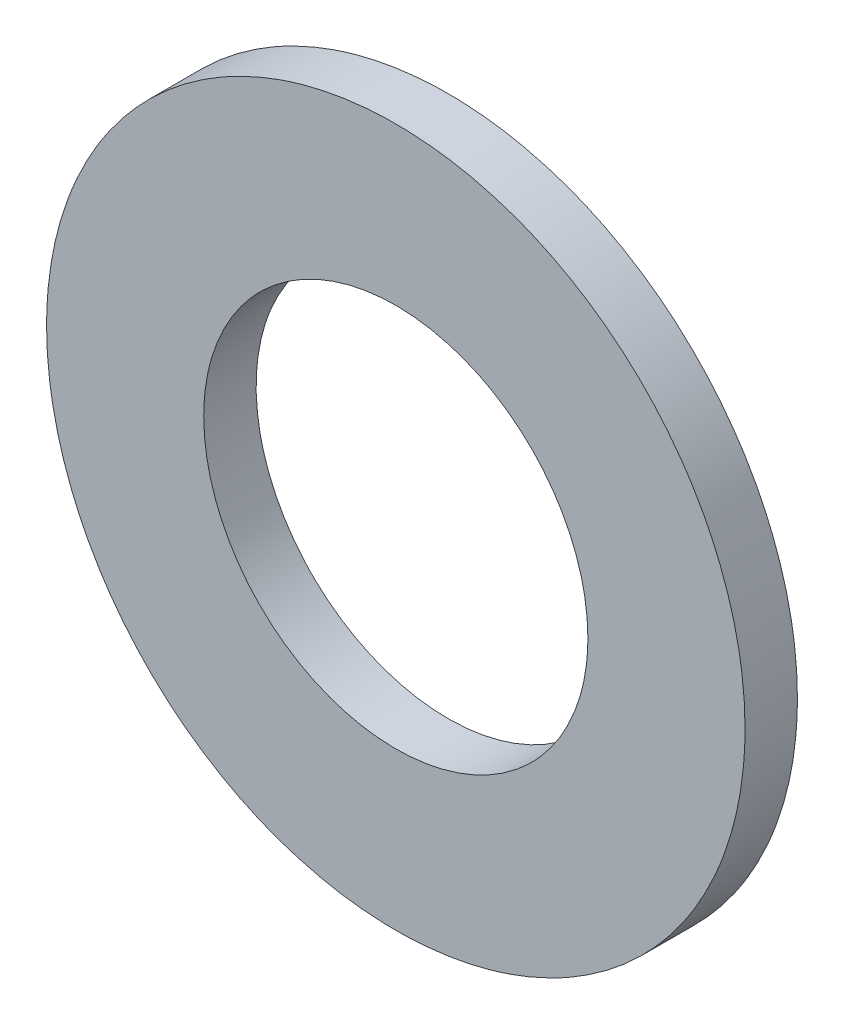
ISO-10303-21;
HEADER;
FILE_DESCRIPTION(('STEP AP214'),'2;1');
FILE_NAME('part.step','',(''),(''),'','','');
FILE_SCHEMA(('AUTOMOTIVE_DESIGN { 1 0 10303 214 1 1 1 1 }'));
ENDSEC;
DATA;
#1=APPLICATION_CONTEXT('core data for automotive mechanical design processes');
#2=APPLICATION_PROTOCOL_DEFINITION('international standard','automotive_design',2000,#1);
#3=PRODUCT_CONTEXT('',#1,'mechanical');
#4=PRODUCT('Part','Part','',(#3));
#5=PRODUCT_RELATED_PRODUCT_CATEGORY('part','',(#4));
#6=PRODUCT_DEFINITION_FORMATION('','',#4);
#7=PRODUCT_DEFINITION_CONTEXT('part definition',#1,'design');
#8=PRODUCT_DEFINITION('design','',#6,#7);
#9=PRODUCT_DEFINITION_SHAPE('','',#8);
#10=(LENGTH_UNIT() NAMED_UNIT(*) SI_UNIT(.MILLI.,.METRE.));
#11=(NAMED_UNIT(*) PLANE_ANGLE_UNIT() SI_UNIT($,.RADIAN.));
#12=(NAMED_UNIT(*) SI_UNIT($,.STERADIAN.) SOLID_ANGLE_UNIT());
#13=UNCERTAINTY_MEASURE_WITH_UNIT(LENGTH_MEASURE(1.E-05),#10,'distance_accuracy_value','');
#14=(GEOMETRIC_REPRESENTATION_CONTEXT(3) GLOBAL_UNCERTAINTY_ASSIGNED_CONTEXT((#13)) GLOBAL_UNIT_ASSIGNED_CONTEXT((#10,
#11,#12)) REPRESENTATION_CONTEXT('',''));
#15=CARTESIAN_POINT('',(0.,0.,0.));
#16=DIRECTION('',(0.,0.,1.));
#17=DIRECTION('',(1.,0.,0.));
#18=AXIS2_PLACEMENT_3D('',#15,#16,#17);
#19=CARTESIAN_POINT('',(2.,0.,0.));
#20=CARTESIAN_POINT('',(2.,0.,0.3));
#21=(BOUNDED_CURVE() B_SPLINE_CURVE(1,(#19,#20),.UNSPECIFIED.,.F.,
.F.) B_SPLINE_CURVE_WITH_KNOTS((2,2),(0.,1.),
.UNSPECIFIED.) CURVE() GEOMETRIC_REPRESENTATION_ITEM() RATIONAL_B_SPLINE_CURVE((1.,1.)) REPRESENTATION_ITEM(''));
#22=CARTESIAN_POINT('',(0.,0.,0.));
#23=DIRECTION('',(0.,0.,1.));
#24=AXIS1_PLACEMENT('',#22,#23);
#25=SURFACE_OF_REVOLUTION('',#21,#24);
#26=CARTESIAN_POINT('',(2.,-1.19723388120618E-10,0.));
#27=CARTESIAN_POINT('',(1.99999374964733,0.101471545655491,0.));
#28=CARTESIAN_POINT('',(1.9922462661829,0.203047032519909,0.));
#29=CARTESIAN_POINT('',(1.96915848261671,0.353564355689939,0.));
#30=CARTESIAN_POINT('',(1.9595396699553,0.403466720602136,0.));
#31=CARTESIAN_POINT('',(1.93652787874192,0.502434849468554,0.));
#32=CARTESIAN_POINT('',(1.92313227173047,0.551500005457144,0.));
#33=CARTESIAN_POINT('',(1.87742339400821,0.696832336233023,0.));
#34=CARTESIAN_POINT('',(1.83956100975539,0.791411834083371,0.));
#35=CARTESIAN_POINT('',(1.749904980245,0.973732326347255,0.));
#36=CARTESIAN_POINT('',(1.69810923338057,1.06147228655772,0.));
#37=CARTESIAN_POINT('',(1.60780245369308,1.19085738412665,0.));
#38=CARTESIAN_POINT('',(1.57366659160416,1.23561071511821,0.));
#39=CARTESIAN_POINT('',(1.50178124761431,1.32204848564332,0.));
#40=CARTESIAN_POINT('',(1.46403467485654,1.36373534870662,0.));
#41=CARTESIAN_POINT('',(1.34567352010553,1.48383811285137,0.));
#42=CARTESIAN_POINT('',(1.25992588337208,1.55731280126526,0.));
#43=CARTESIAN_POINT('',(1.07736597535085,1.68877203479537,0.));
#44=CARTESIAN_POINT('',(0.98055510172284,1.74675853350988,0.));
#45=CARTESIAN_POINT('',(0.778566473677936,1.84566283429967,0.));
#46=CARTESIAN_POINT('',(0.673389212096714,1.88658164088981,0.));
#47=CARTESIAN_POINT('',(0.457658124305838,1.95017896187786,0.));
#48=CARTESIAN_POINT('',(0.347104162918828,1.97285701742747,0.));
#49=CARTESIAN_POINT('',(0.123757160681395,1.99933250649233,0.));
#50=CARTESIAN_POINT('',(0.0109641006778054,2.00312977843213,0.));
#51=CARTESIAN_POINT('',(-0.213660882518615,1.9917311721725,0.));
#52=CARTESIAN_POINT('',(-0.325492812304592,1.97653542436594,0.));
#53=CARTESIAN_POINT('',(-0.545006571711363,1.92759454561525,0.));
#54=CARTESIAN_POINT('',(-0.652688379860726,1.89384931871569,0.));
#55=CARTESIAN_POINT('',(-0.860906823306381,1.80872135043782,0.));
#56=CARTESIAN_POINT('',(-0.961443276025895,1.75733815857297,0.));
#57=CARTESIAN_POINT('',(-1.1045958513711,1.66824443791303,0.));
#58=CARTESIAN_POINT('',(-1.15104551844331,1.63653674428713,0.));
#59=CARTESIAN_POINT('',(-1.24115890349447,1.56929512979768,0.));
#60=CARTESIAN_POINT('',(-1.28481989519712,1.53375755324819,0.));
#61=CARTESIAN_POINT('',(-1.41101053842834,1.42185267149277,0.));
#62=CARTESIAN_POINT('',(-1.48887628514136,1.3401131062039,0.));
#63=CARTESIAN_POINT('',(-1.62975747286988,1.16470694391755,0.));
#64=CARTESIAN_POINT('',(-1.69277330488127,1.07104066104867,0.));
#65=CARTESIAN_POINT('',(-1.77483822259994,0.923650736013582,0.));
#66=CARTESIAN_POINT('',(-1.80013667673005,0.873315977644029,0.));
#67=CARTESIAN_POINT('',(-1.84638652003897,0.770724345704285,0.));
#68=CARTESIAN_POINT('',(-1.86734161146276,0.718469154204224,0.));
#69=CARTESIAN_POINT('',(-1.90475191274033,0.612436719793417,0.));
#70=CARTESIAN_POINT('',(-1.9212117794333,0.558661116199001,0.));
#71=CARTESIAN_POINT('',(-1.94954490040444,0.44992339959909,0.));
#72=CARTESIAN_POINT('',(-1.96141880187861,0.394961455173206,0.));
#73=CARTESIAN_POINT('',(-1.98061554937194,0.283541024493209,0.));
#74=CARTESIAN_POINT('',(-1.98788009131722,0.227072430827125,0.));
#75=CARTESIAN_POINT('',(-1.99757374570503,0.113746746397617,0.));
#76=CARTESIAN_POINT('',(-2.00000350425991,0.0568897085644001,0.));
#77=CARTESIAN_POINT('',(-1.9999937496135,-0.101471546322658,0.));
#78=CARTESIAN_POINT('',(-1.99224626611517,-0.203047033184593,0.));
#79=CARTESIAN_POINT('',(-1.96915848249873,-0.353564356346985,0.));
#80=CARTESIAN_POINT('',(-1.9595396698207,-0.40346672125584,0.));
#81=CARTESIAN_POINT('',(-1.93652787857437,-0.50243485011432,0.));
#82=CARTESIAN_POINT('',(-1.92313227154659,-0.551500006098314,0.));
#83=CARTESIAN_POINT('',(-1.87742339377593,-0.696832336858831,0.));
#84=CARTESIAN_POINT('',(-1.83956100949158,-0.791411834696566,0.));
#85=CARTESIAN_POINT('',(-1.74990497992041,-0.973732326930567,0.));
#86=CARTESIAN_POINT('',(-1.69810923302674,-1.06147228712376,0.));
#87=CARTESIAN_POINT('',(-1.60780245329612,-1.19085738466259,0.));
#88=CARTESIAN_POINT('',(-1.57366659119228,-1.23561071564277,0.));
#89=CARTESIAN_POINT('',(-1.50178124717361,-1.32204848614394,0.));
#90=CARTESIAN_POINT('',(-1.46403467440193,-1.36373534919466,0.));
#91=CARTESIAN_POINT('',(-1.34567351961089,-1.48383811329994,0.));
#92=CARTESIAN_POINT('',(-1.25992588285296,-1.55731280168525,0.));
#93=CARTESIAN_POINT('',(-1.07736597478793,-1.68877203515449,0.));
#94=CARTESIAN_POINT('',(-0.980555101140592,-1.74675853383673,0.));
#95=CARTESIAN_POINT('',(-0.77856647306272,-1.84566283455919,0.));
#96=CARTESIAN_POINT('',(-0.673389211467857,-1.88658164111427,0.));
#97=CARTESIAN_POINT('',(-0.457658123655778,-1.95017896203041,0.));
#98=CARTESIAN_POINT('',(-0.34710416226121,-1.97285701754317,0.));
#99=CARTESIAN_POINT('',(-0.123757160014951,-1.99933250653358,0.));
#100=CARTESIAN_POINT('',(-0.0109641000100959,-2.00312977843578,0.));
#101=CARTESIAN_POINT('',(0.213660883182523,-1.99173117210128,0.));
#102=CARTESIAN_POINT('',(0.325492812963432,-1.97653542425744,0.));
#103=CARTESIAN_POINT('',(0.545006572353889,-1.92759454543358,0.));
#104=CARTESIAN_POINT('',(0.652688380492006,-1.89384931849813,0.));
#105=CARTESIAN_POINT('',(0.860906823909302,-1.80872135015084,0.));
#106=CARTESIAN_POINT('',(0.961443276611702,-1.75733815825248,0.));
#107=CARTESIAN_POINT('',(1.10459585192722,-1.66824443754481,0.));
#108=CARTESIAN_POINT('',(1.15104551898885,-1.63653674390343,0.));
#109=CARTESIAN_POINT('',(1.24115890401757,-1.56929512938396,0.));
#110=CARTESIAN_POINT('',(1.28481989570838,-1.53375755281991,0.));
#111=CARTESIAN_POINT('',(1.4110105389023,-1.42185267102243,0.));
#112=CARTESIAN_POINT('',(1.48887628558807,-1.3401131057076,0.));
#113=CARTESIAN_POINT('',(1.62975747325813,-1.16470694337428,0.));
#114=CARTESIAN_POINT('',(1.69277330523829,-1.07104066048441,0.));
#115=CARTESIAN_POINT('',(1.7748382229079,-0.923650735421831,0.));
#116=CARTESIAN_POINT('',(1.8001366770213,-0.873315977043698,0.));
#117=CARTESIAN_POINT('',(1.84638652029614,-0.77072434508821,0.));
#118=CARTESIAN_POINT('',(1.86734161170256,-0.718469153580982,0.));
#119=CARTESIAN_POINT('',(1.90475191294475,-0.612436719157641,0.));
#120=CARTESIAN_POINT('',(1.92121177961973,-0.558661115557868,0.));
#121=CARTESIAN_POINT('',(1.9495449005545,-0.449923398948803,0.));
#122=CARTESIAN_POINT('',(1.96141880201031,-0.394961454519125,0.));
#123=CARTESIAN_POINT('',(1.98061554942874,-0.283541024051963,0.));
#124=CARTESIAN_POINT('',(1.98788009133616,-0.227072430605768,0.));
#125=CARTESIAN_POINT('',(1.99757374568609,-0.113746746619087,0.));
#126=CARTESIAN_POINT('',(2.00000350424093,-0.056889709008809,0.));
#127=CARTESIAN_POINT('',(2.,-1.19723388120618E-10,0.));
#128=B_SPLINE_CURVE_WITH_KNOTS('',3,(#26,#27,#28,#29,#30,#31,#32,#33,#34,#35,#36,#37,#38,#39,
#40,#41,#42,#43,#44,#45,#46,#47,#48,#49,#50,#51,#52,#53,#54,#55,#56,#57,#58,#59,#60,#61,#62,#63,
#64,#65,#66,#67,#68,#69,#70,#71,#72,#73,#74,#75,#76,#77,#78,#79,#80,#81,#82,#83,#84,#85,#86,#87,
#88,#89,#90,#91,#92,#93,#94,#95,#96,#97,#98,#99,#100,#101,#102,#103,#104,#105,#106,#107,#108,
#109,#110,#111,#112,#113,#114,#115,#116,#117,#118,#119,#120,#121,#122,#123,#124,#125,#126,#127),
.UNSPECIFIED.,.T.,.F.,(4,2,2,2,2,2,2,2,2,2,2,2,2,2,2,2,2,2,2,2,2,2,2,2,2,2,2,2,2,2,2,2,2,2,2,2,
2,2,2,2,2,2,2,2,2,2,2,2,2,2,4),(0.,0.304221649078269,0.456566412825359,0.609017463715569,
0.913392579840734,1.2178136314567,1.38648925094791,1.55503009546644,1.89205174002682,
2.22903085436364,2.56599013307729,2.90295788777729,3.23992852612981,3.57689685108868,
3.91386691918235,4.25084559437863,4.4193942026811,4.58810514271525,4.92507877596799,
5.26204353576739,5.43088010645555,5.59957216502521,5.76808879795875,5.93658164022327,
6.10716536734595,6.27772629641406,6.58194794549317,6.73429270923981,6.88674376012963,
7.19111887625481,7.49553992787076,7.66421554736199,7.83275639188055,8.16977803644087,
8.50675715077769,8.84371642949135,9.18068418419135,9.51765482254387,9.85462314750273,
10.1915932155964,10.5285718907927,10.6971204990952,10.8658314391293,11.2028050723821,
11.5397698321815,11.7086064028701,11.8772984614403,12.0458150943735,12.2143079366373,
12.3848916630939,12.555452591496),.UNSPECIFIED.);
#129=CARTESIAN_POINT('',(2.,-1.19723388120618E-10,0.));
#130=VERTEX_POINT('',#129);
#131=EDGE_CURVE('E20',#130,#130,#128,.T.);
#132=ORIENTED_EDGE('',*,*,#131,.T.);
#133=EDGE_LOOP('',(#132));
#134=FACE_BOUND('',#133,.T.);
#135=CARTESIAN_POINT('',(-2.,-5.46942690457236E-10,0.3));
#136=CARTESIAN_POINT('',(-1.9999937496135,-0.101471546322658,0.3));
#137=CARTESIAN_POINT('',(-1.99224626611517,-0.203047033184594,0.3));
#138=CARTESIAN_POINT('',(-1.96915848249873,-0.353564356346986,0.3));
#139=CARTESIAN_POINT('',(-1.9595396698207,-0.40346672125584,0.3));
#140=CARTESIAN_POINT('',(-1.93652787857437,-0.50243485011432,0.3));
#141=CARTESIAN_POINT('',(-1.92313227154659,-0.551500006098314,0.3));
#142=CARTESIAN_POINT('',(-1.87742339377593,-0.696832336858831,0.3));
#143=CARTESIAN_POINT('',(-1.83956100949158,-0.791411834696566,0.3));
#144=CARTESIAN_POINT('',(-1.74990497992041,-0.973732326930567,0.3));
#145=CARTESIAN_POINT('',(-1.69810923302674,-1.06147228712376,0.3));
#146=CARTESIAN_POINT('',(-1.60780245329612,-1.19085738466259,0.3));
#147=CARTESIAN_POINT('',(-1.57366659119228,-1.23561071564277,0.3));
#148=CARTESIAN_POINT('',(-1.50178124717361,-1.32204848614394,0.3));
#149=CARTESIAN_POINT('',(-1.46403467440193,-1.36373534919466,0.3));
#150=CARTESIAN_POINT('',(-1.34567351961089,-1.48383811329994,0.3));
#151=CARTESIAN_POINT('',(-1.25992588285296,-1.55731280168525,0.3));
#152=CARTESIAN_POINT('',(-1.07736597478793,-1.68877203515449,0.3));
#153=CARTESIAN_POINT('',(-0.980555101140592,-1.74675853383673,0.3));
#154=CARTESIAN_POINT('',(-0.77856647306272,-1.84566283455919,0.3));
#155=CARTESIAN_POINT('',(-0.673389211467857,-1.88658164111427,0.3));
#156=CARTESIAN_POINT('',(-0.457658123655779,-1.95017896203041,0.3));
#157=CARTESIAN_POINT('',(-0.34710416226121,-1.97285701754317,0.3));
#158=CARTESIAN_POINT('',(-0.123757160014951,-1.99933250653358,0.3));
#159=CARTESIAN_POINT('',(-0.0109641000100959,-2.00312977843578,0.3));
#160=CARTESIAN_POINT('',(0.213660883182523,-1.99173117210128,0.3));
#161=CARTESIAN_POINT('',(0.325492812963432,-1.97653542425744,0.3));
#162=CARTESIAN_POINT('',(0.54500657235389,-1.92759454543358,0.3));
#163=CARTESIAN_POINT('',(0.652688380492006,-1.89384931849813,0.3));
#164=CARTESIAN_POINT('',(0.860906823909302,-1.80872135015084,0.3));
#165=CARTESIAN_POINT('',(0.961443276611702,-1.75733815825248,0.3));
#166=CARTESIAN_POINT('',(1.10459585192722,-1.66824443754481,0.3));
#167=CARTESIAN_POINT('',(1.15104551898885,-1.63653674390343,0.3));
#168=CARTESIAN_POINT('',(1.24115890401757,-1.56929512938396,0.3));
#169=CARTESIAN_POINT('',(1.28481989570838,-1.53375755281991,0.3));
#170=CARTESIAN_POINT('',(1.4110105389023,-1.42185267102243,0.3));
#171=CARTESIAN_POINT('',(1.48887628558807,-1.3401131057076,0.3));
#172=CARTESIAN_POINT('',(1.62975747325813,-1.16470694337428,0.3));
#173=CARTESIAN_POINT('',(1.69277330523829,-1.07104066048441,0.3));
#174=CARTESIAN_POINT('',(1.7748382229079,-0.923650735421831,0.3));
#175=CARTESIAN_POINT('',(1.8001366770213,-0.873315977043698,0.3));
#176=CARTESIAN_POINT('',(1.84638652029614,-0.77072434508821,0.3));
#177=CARTESIAN_POINT('',(1.86734161170256,-0.718469153580982,0.3));
#178=CARTESIAN_POINT('',(1.90475191294475,-0.612436719157641,0.3));
#179=CARTESIAN_POINT('',(1.92121177961973,-0.558661115557868,0.3));
#180=CARTESIAN_POINT('',(1.9495449005545,-0.449923398948803,0.3));
#181=CARTESIAN_POINT('',(1.96141880201031,-0.394961454519125,0.3));
#182=CARTESIAN_POINT('',(1.98061554942874,-0.283541024051963,0.3));
#183=CARTESIAN_POINT('',(1.98788009133616,-0.227072430605767,0.3));
#184=CARTESIAN_POINT('',(1.99757374568609,-0.113746746619087,0.3));
#185=CARTESIAN_POINT('',(2.00000350424093,-0.056889709008809,0.3));
#186=CARTESIAN_POINT('',(1.99999374964733,0.101471545655491,0.3));
#187=CARTESIAN_POINT('',(1.9922462661829,0.203047032519909,0.3));
#188=CARTESIAN_POINT('',(1.96915848261671,0.353564355689939,0.3));
#189=CARTESIAN_POINT('',(1.9595396699553,0.403466720602136,0.3));
#190=CARTESIAN_POINT('',(1.93652787874192,0.502434849468554,0.3));
#191=CARTESIAN_POINT('',(1.92313227173047,0.551500005457144,0.3));
#192=CARTESIAN_POINT('',(1.87742339400821,0.696832336233023,0.3));
#193=CARTESIAN_POINT('',(1.83956100975539,0.791411834083371,0.3));
#194=CARTESIAN_POINT('',(1.749904980245,0.973732326347255,0.3));
#195=CARTESIAN_POINT('',(1.69810923338057,1.06147228655772,0.3));
#196=CARTESIAN_POINT('',(1.60780245369308,1.19085738412665,0.3));
#197=CARTESIAN_POINT('',(1.57366659160416,1.23561071511821,0.3));
#198=CARTESIAN_POINT('',(1.50178124761431,1.32204848564332,0.3));
#199=CARTESIAN_POINT('',(1.46403467485654,1.36373534870662,0.3));
#200=CARTESIAN_POINT('',(1.34567352010553,1.48383811285137,0.3));
#201=CARTESIAN_POINT('',(1.25992588337208,1.55731280126526,0.3));
#202=CARTESIAN_POINT('',(1.07736597535085,1.68877203479537,0.3));
#203=CARTESIAN_POINT('',(0.98055510172284,1.74675853350988,0.3));
#204=CARTESIAN_POINT('',(0.778566473677936,1.84566283429967,0.3));
#205=CARTESIAN_POINT('',(0.673389212096714,1.88658164088981,0.3));
#206=CARTESIAN_POINT('',(0.457658124305838,1.95017896187786,0.3));
#207=CARTESIAN_POINT('',(0.347104162918829,1.97285701742747,0.3));
#208=CARTESIAN_POINT('',(0.123757160681395,1.99933250649233,0.3));
#209=CARTESIAN_POINT('',(0.0109641006778055,2.00312977843213,0.3));
#210=CARTESIAN_POINT('',(-0.213660882518615,1.9917311721725,0.3));
#211=CARTESIAN_POINT('',(-0.325492812304592,1.97653542436594,0.3));
#212=CARTESIAN_POINT('',(-0.545006571711363,1.92759454561525,0.3));
#213=CARTESIAN_POINT('',(-0.652688379860726,1.89384931871569,0.3));
#214=CARTESIAN_POINT('',(-0.860906823306381,1.80872135043782,0.3));
#215=CARTESIAN_POINT('',(-0.961443276025895,1.75733815857297,0.3));
#216=CARTESIAN_POINT('',(-1.1045958513711,1.66824443791303,0.3));
#217=CARTESIAN_POINT('',(-1.15104551844331,1.63653674428713,0.3));
#218=CARTESIAN_POINT('',(-1.24115890349447,1.56929512979768,0.3));
#219=CARTESIAN_POINT('',(-1.28481989519712,1.53375755324819,0.3));
#220=CARTESIAN_POINT('',(-1.41101053842834,1.42185267149277,0.3));
#221=CARTESIAN_POINT('',(-1.48887628514136,1.3401131062039,0.3));
#222=CARTESIAN_POINT('',(-1.62975747286988,1.16470694391755,0.3));
#223=CARTESIAN_POINT('',(-1.69277330488127,1.07104066104867,0.3));
#224=CARTESIAN_POINT('',(-1.77483822259994,0.923650736013582,0.3));
#225=CARTESIAN_POINT('',(-1.80013667673005,0.873315977644028,0.3));
#226=CARTESIAN_POINT('',(-1.84638652003897,0.770724345704285,0.3));
#227=CARTESIAN_POINT('',(-1.86734161146276,0.718469154204224,0.3));
#228=CARTESIAN_POINT('',(-1.90475191274033,0.612436719793417,0.3));
#229=CARTESIAN_POINT('',(-1.9212117794333,0.558661116199001,0.3));
#230=CARTESIAN_POINT('',(-1.94954490040444,0.44992339959909,0.3));
#231=CARTESIAN_POINT('',(-1.96141880187861,0.394961455173206,0.3));
#232=CARTESIAN_POINT('',(-1.98061554937194,0.283541024493209,0.3));
#233=CARTESIAN_POINT('',(-1.98788009131722,0.227072430827125,0.3));
#234=CARTESIAN_POINT('',(-1.99757374570504,0.113746746397617,0.3));
#235=CARTESIAN_POINT('',(-2.00000350425991,0.0568897085643994,0.3));
#236=CARTESIAN_POINT('',(-2.,-5.46942690457236E-10,0.3));
#237=B_SPLINE_CURVE_WITH_KNOTS('',3,(#135,#136,#137,#138,#139,#140,#141,#142,#143,#144,#145,
#146,#147,#148,#149,#150,#151,#152,#153,#154,#155,#156,#157,#158,#159,#160,#161,#162,#163,#164,
#165,#166,#167,#168,#169,#170,#171,#172,#173,#174,#175,#176,#177,#178,#179,#180,#181,#182,#183,
#184,#185,#186,#187,#188,#189,#190,#191,#192,#193,#194,#195,#196,#197,#198,#199,#200,#201,#202,
#203,#204,#205,#206,#207,#208,#209,#210,#211,#212,#213,#214,#215,#216,#217,#218,#219,#220,#221,
#222,#223,#224,#225,#226,#227,#228,#229,#230,#231,#232,#233,#234,#235,#236),.UNSPECIFIED.,.T.,
.F.,(4,2,2,2,2,2,2,2,2,2,2,2,2,2,2,2,2,2,2,2,2,2,2,2,2,2,2,2,2,2,2,2,2,2,2,2,2,2,2,2,2,2,2,2,2,
2,2,2,2,2,4),(0.,0.304221649079109,0.456566412825749,0.609017463715566,0.913392579840749,
1.2178136314567,1.38648925094793,1.55503009546648,1.89205174002681,2.22903085436363,
2.56599013307729,2.90295788777729,3.23992852612981,3.57689685108867,3.91386691918235,
4.25084559437867,4.41939420268112,4.58810514271524,4.92507877596801,5.26204353576739,
5.43088010645603,5.59957216502624,5.7680887979594,5.93658164022326,6.10716536667981,
6.27772629508194,6.58194794416021,6.7342927079073,6.88674375879751,7.19111887492268,
7.49553992653865,7.66421554602985,7.83275639054838,8.16977803510876,8.50675714944558,
8.84371642815923,9.18068418285924,9.51765482121175,9.85462314617062,10.1915932142643,
10.5285718894606,10.697120497763,10.8658314377972,11.2028050710499,11.5397698308493,
11.7086064015375,11.8772984601072,12.0458150930407,12.2143079353052,12.3848916624279,
12.555452591496),.UNSPECIFIED.);
#238=CARTESIAN_POINT('',(-2.,-5.46942690457236E-10,0.3));
#239=VERTEX_POINT('',#238);
#240=EDGE_CURVE('E38',#239,#239,#237,.T.);
#241=ORIENTED_EDGE('',*,*,#240,.F.);
#242=EDGE_LOOP('',(#241));
#243=FACE_BOUND('',#242,.T.);
#244=ADVANCED_FACE('F15',(#134,#243),#25,.T.);
#245=CARTESIAN_POINT('',(-2.024,-2.024,0.));
#246=DIRECTION('',(0.,0.,1.));
#247=DIRECTION('',(1.,0.,0.));
#248=AXIS2_PLACEMENT_3D('',#245,#246,#247);
#249=PLANE('',#248);
#250=CARTESIAN_POINT('',(1.1,-6.58478634663398E-11,0.));
#251=CARTESIAN_POINT('',(1.09999891488191,-0.0505932986995829,0.));
#252=CARTESIAN_POINT('',(1.09650077965717,-0.10121228907971,0.));
#253=CARTESIAN_POINT('',(1.08256870618609,-0.201535443645985,0.));
#254=CARTESIAN_POINT('',(1.07212535444755,-0.25123827197785,0.));
#255=CARTESIAN_POINT('',(1.04143593464092,-0.359483302073582,0.));
#256=CARTESIAN_POINT('',(1.01953936881721,-0.417566153309032,0.));
#257=CARTESIAN_POINT('',(0.966302814642607,-0.529234155237708,0.));
#258=CARTESIAN_POINT('',(0.934960249364635,-0.582818073487471,0.));
#259=CARTESIAN_POINT('',(0.863725813886621,-0.683960694152757,0.));
#260=CARTESIAN_POINT('',(0.823834838145753,-0.731520026120445,0.));
#261=CARTESIAN_POINT('',(0.736637353111067,-0.819262531261365,0.));
#262=CARTESIAN_POINT('',(0.689331317227864,-0.859446174976207,0.));
#263=CARTESIAN_POINT('',(0.588643211188525,-0.931302580353416,0.));
#264=CARTESIAN_POINT('',(0.535260982996086,-0.962975120577588,0.));
#265=CARTESIAN_POINT('',(0.423936257940842,-1.01690887930246,0.));
#266=CARTESIAN_POINT('',(0.365993707310009,-1.03916998681887,0.));
#267=CARTESIAN_POINT('',(0.247193885089152,-1.07364826767652,0.));
#268=CARTESIAN_POINT('',(0.186336629968931,-1.08586549776452,0.));
#269=CARTESIAN_POINT('',(0.0634353160595711,-1.09990987380889,0.));
#270=CARTESIAN_POINT('',(0.00139125785457074,-1.10173702487907,0.));
#271=CARTESIAN_POINT('',(-0.122124642763529,-1.09494762471735,0.));
#272=CARTESIAN_POINT('',(-0.183596486578298,-1.08633109907456,0.));
#273=CARTESIAN_POINT('',(-0.304214669694389,-1.0589055489064,0.));
#274=CARTESIAN_POINT('',(-0.363360996453435,-1.04009646941732,0.));
#275=CARTESIAN_POINT('',(-0.477683024916454,-0.992794318069692,0.));
#276=CARTESIAN_POINT('',(-0.532858623600911,-0.964300995065613,0.));
#277=CARTESIAN_POINT('',(-0.611385538475719,-0.914968355862128,0.));
#278=CARTESIAN_POINT('',(-0.636859189147209,-0.897421713759455,0.));
#279=CARTESIAN_POINT('',(-0.6862653697723,-0.860230527728237,0.));
#280=CARTESIAN_POINT('',(-0.710196391580667,-0.840583979244022,0.));
#281=CARTESIAN_POINT('',(-0.779341531329452,-0.778744432723548,0.));
#282=CARTESIAN_POINT('',(-0.82197812284457,-0.733607209233725,0.));
#283=CARTESIAN_POINT('',(-0.899055712199224,-0.636809712226972,0.));
#284=CARTESIAN_POINT('',(-0.933496934069097,-0.58514961707973,0.));
#285=CARTESIAN_POINT('',(-0.978291297265167,-0.503892447970937,0.));
#286=CARTESIAN_POINT('',(-0.992088972704083,-0.47614796337225,0.));
#287=CARTESIAN_POINT('',(-1.01728745130884,-0.419623428101545,0.));
#288=CARTESIAN_POINT('',(-1.028690286567,-0.390844279859309,0.));
#289=CARTESIAN_POINT('',(-1.05916611072812,-0.303270814250122,0.));
#290=CARTESIAN_POINT('',(-1.07456631406802,-0.243131605579201,0.));
#291=CARTESIAN_POINT('',(-1.08986270322905,-0.152106242976512,0.));
#292=CARTESIAN_POINT('',(-1.09366092892858,-0.121810410239539,0.));
#293=CARTESIAN_POINT('',(-1.09872947439376,-0.0610127839371093,0.));
#294=CARTESIAN_POINT('',(-1.10000065438692,-0.0305110640062748,0.));
#295=CARTESIAN_POINT('',(-1.09999891489877,0.0505932983326965,0.));
#296=CARTESIAN_POINT('',(-1.09650077969093,0.101212288713934,0.));
#297=CARTESIAN_POINT('',(-1.08256870625332,0.20153544328491,0.));
#298=CARTESIAN_POINT('',(-1.07212535453133,0.251238271620363,0.));
#299=CARTESIAN_POINT('',(-1.04143593476074,0.359483301726465,0.));
#300=CARTESIAN_POINT('',(-1.01953936895637,0.417566152969254,0.));
#301=CARTESIAN_POINT('',(-0.96630281481898,0.529234154915676,0.));
#302=CARTESIAN_POINT('',(-0.934960249558886,0.582818073175849,0.));
#303=CARTESIAN_POINT('',(-0.863725814114613,0.683960693864841,0.));
#304=CARTESIAN_POINT('',(-0.823834838389603,0.731520025845821,0.));
#305=CARTESIAN_POINT('',(-0.736637353384167,0.81926253101581,0.));
#306=CARTESIAN_POINT('',(-0.689331317514353,0.859446174746425,0.));
#307=CARTESIAN_POINT('',(-0.588643211498959,0.931302580157202,0.));
#308=CARTESIAN_POINT('',(-0.535260983317076,0.962975120399169,0.));
#309=CARTESIAN_POINT('',(-0.42393625827981,1.01690887916115,0.));
#310=CARTESIAN_POINT('',(-0.365993707656398,1.03916998669687,0.));
#311=CARTESIAN_POINT('',(-0.247193885447035,1.07364826759412,0.));
#312=CARTESIAN_POINT('',(-0.186336630330886,1.08586549770241,0.));
#313=CARTESIAN_POINT('',(-0.0634353164262077,1.09990987378774,0.));
#314=CARTESIAN_POINT('',(-0.00139125822181635,1.1017370248786,0.));
#315=CARTESIAN_POINT('',(0.122124642398548,1.09494762475805,0.));
#316=CARTESIAN_POINT('',(0.18359648621619,1.08633109913576,0.));
#317=CARTESIAN_POINT('',(0.304214669341423,1.05890554900781,0.));
#318=CARTESIAN_POINT('',(0.363360996106737,1.04009646953844,0.));
#319=CARTESIAN_POINT('',(0.477683024585515,0.992794318228923,0.));
#320=CARTESIAN_POINT('',(0.532858623279461,0.96430099524324,0.));
#321=CARTESIAN_POINT('',(0.611385538170711,0.914968356065936,0.));
#322=CARTESIAN_POINT('',(0.636859188848055,0.897421713971751,0.));
#323=CARTESIAN_POINT('',(0.68626536948555,0.860230527956997,0.));
#324=CARTESIAN_POINT('',(0.710196391300469,0.840583979480757,0.));
#325=CARTESIAN_POINT('',(0.779341531069867,0.778744432983332,0.));
#326=CARTESIAN_POINT('',(0.821978122600029,0.733607209507724,0.));
#327=CARTESIAN_POINT('',(0.899055711986949,0.636809712526663,0.));
#328=CARTESIAN_POINT('',(0.933496933874045,0.585149617390896,0.));
#329=CARTESIAN_POINT('',(0.97829129709716,0.503892448297114,0.));
#330=CARTESIAN_POINT('',(0.992088972545287,0.47614796370311,0.));
#331=CARTESIAN_POINT('',(1.01728745116882,0.419623428440977,0.));
#332=CARTESIAN_POINT('',(1.02869028643655,0.390844280202632,0.));
#333=CARTESIAN_POINT('',(1.05916611062693,0.303270814603578,0.));
#334=CARTESIAN_POINT('',(1.07456631398691,0.24313160593773,0.));
#335=CARTESIAN_POINT('',(1.08986270319862,0.152106243219175,0.));
#336=CARTESIAN_POINT('',(1.09366092891844,0.121810410361249,0.));
#337=CARTESIAN_POINT('',(1.09872947440391,0.0610127838152549,0.));
#338=CARTESIAN_POINT('',(1.10000065439709,0.0305110637618098,0.));
#339=CARTESIAN_POINT('',(1.1,-6.58478634663398E-11,0.));
#340=B_SPLINE_CURVE_WITH_KNOTS('',3,(#250,#251,#252,#253,#254,#255,#256,#257,#258,#259,#260,
#261,#262,#263,#264,#265,#266,#267,#268,#269,#270,#271,#272,#273,#274,#275,#276,#277,#278,#279,
#280,#281,#282,#283,#284,#285,#286,#287,#288,#289,#290,#291,#292,#293,#294,#295,#296,#297,#298,
#299,#300,#301,#302,#303,#304,#305,#306,#307,#308,#309,#310,#311,#312,#313,#314,#315,#316,#317,
#318,#319,#320,#321,#322,#323,#324,#325,#326,#327,#328,#329,#330,#331,#332,#333,#334,#335,#336,
#337,#338,#339),.UNSPECIFIED.,.T.,.F.,(4,2,2,2,2,2,2,2,2,2,2,2,2,2,2,2,2,2,2,2,2,2,2,2,2,2,2,2,
2,2,2,2,2,2,2,2,2,2,2,2,2,2,2,2,4),(0.,0.151700908062769,0.303607850551205,0.488915609161527,
0.674273966705429,0.859612938820781,1.04494008288299,1.23027204823963,1.41560619906185,
1.60093930276011,1.78627231524076,1.97160487361907,2.15693843141966,2.34227679591947,
2.43497847684191,2.52776945411355,2.7131050456802,2.89843557029221,2.99129482542153,
3.08407496552418,3.26926698401047,3.36078369869495,3.45226925498562,3.60397016304802,
3.75587710553682,3.94118486414726,4.12654322169105,4.31188219380638,4.49720933786861,
4.68254130322526,4.86787545404747,5.05320855774573,5.23854157022638,5.42387412860469,
5.60920768640528,5.79454605090506,5.88724773182751,5.98003870909917,6.16537430066581,
6.35070482527783,6.44356408040689,6.53634422050923,6.72153623899608,6.81305295404702,
6.90453851070394),.UNSPECIFIED.);
#341=CARTESIAN_POINT('',(1.1,-6.58478634663398E-11,0.));
#342=VERTEX_POINT('',#341);
#343=EDGE_CURVE('E29',#342,#342,#340,.T.);
#344=ORIENTED_EDGE('',*,*,#343,.F.);
#345=EDGE_LOOP('',(#344));
#346=FACE_BOUND('',#345,.T.);
#347=ORIENTED_EDGE('',*,*,#131,.F.);
#348=EDGE_LOOP('',(#347));
#349=FACE_BOUND('',#348,.T.);
#350=ADVANCED_FACE('F65',(#346,#349),#249,.F.);
#351=CARTESIAN_POINT('',(-2.024,-2.024,0.3));
#352=DIRECTION('',(0.,0.,1.));
#353=DIRECTION('',(1.,0.,0.));
#354=AXIS2_PLACEMENT_3D('',#351,#352,#353);
#355=PLANE('',#354);
#356=CARTESIAN_POINT('',(-1.1,-3.0081847975148E-10,0.3));
#357=CARTESIAN_POINT('',(-1.09999891487111,-0.0505932989345532,0.3));
#358=CARTESIAN_POINT('',(-1.09650077963555,-0.101212289313933,0.3));
#359=CARTESIAN_POINT('',(-1.08256870614304,-0.201535443877232,0.3));
#360=CARTESIAN_POINT('',(-1.07212535439388,-0.251238272206866,0.3));
#361=CARTESIAN_POINT('',(-1.04143593456414,-0.359483302296043,0.3));
#362=CARTESIAN_POINT('',(-1.01953936872802,-0.417566153526815,0.3));
#363=CARTESIAN_POINT('',(-0.966302814529558,-0.52923415544412,0.3));
#364=CARTESIAN_POINT('',(-0.93496024924014,-0.582818073687187,0.3));
#365=CARTESIAN_POINT('',(-0.86372581374052,-0.683960694337256,0.3));
#366=CARTESIAN_POINT('',(-0.823834837989493,-0.731520026296424,0.3));
#367=CARTESIAN_POINT('',(-0.736637352936065,-0.819262531418718,0.3));
#368=CARTESIAN_POINT('',(-0.689331317044278,-0.859446175123454,0.3));
#369=CARTESIAN_POINT('',(-0.58864321098959,-0.931302580479156,0.3));
#370=CARTESIAN_POINT('',(-0.535260982790386,-0.962975120691925,0.3));
#371=CARTESIAN_POINT('',(-0.423936257723621,-1.01690887939301,0.3));
#372=CARTESIAN_POINT('',(-0.365993707088033,-1.03916998689705,0.3));
#373=CARTESIAN_POINT('',(-0.247193884859811,-1.07364826772932,0.3));
#374=CARTESIAN_POINT('',(-0.18633662973698,-1.08586549780432,0.3));
#375=CARTESIAN_POINT('',(-0.0634353158246204,-1.09990987382244,0.3));
#376=CARTESIAN_POINT('',(-0.00139125761922966,-1.10173702487936,0.3));
#377=CARTESIAN_POINT('',(0.12212464299742,-1.09494762469126,0.3));
#378=CARTESIAN_POINT('',(0.183596486810348,-1.08633109903534,0.3));
#379=CARTESIAN_POINT('',(0.304214669920581,-1.05890554884142,0.3));
#380=CARTESIAN_POINT('',(0.363360996675609,-1.04009646933971,0.3));
#381=CARTESIAN_POINT('',(0.477683025128524,-0.992794317967655,0.3));
#382=CARTESIAN_POINT('',(0.532858623806894,-0.964300994951789,0.3));
#383=CARTESIAN_POINT('',(0.611385538671164,-0.914968355731531,0.3));
#384=CARTESIAN_POINT('',(0.636859189338907,-0.897421713623416,0.3));
#385=CARTESIAN_POINT('',(0.686265369956052,-0.860230527581644,0.3));
#386=CARTESIAN_POINT('',(0.710196391760223,-0.840583979092318,0.3));
#387=CARTESIAN_POINT('',(0.779341531495798,-0.778744432557074,0.3));
#388=CARTESIAN_POINT('',(0.821978123001275,-0.733607209058143,0.3));
#389=CARTESIAN_POINT('',(0.899055712335252,-0.636809712034925,0.3));
#390=CARTESIAN_POINT('',(0.93349693419409,-0.585149616880326,0.3));
#391=CARTESIAN_POINT('',(0.978291297372804,-0.503892447761965,0.3));
#392=CARTESIAN_POINT('',(0.992088972805793,-0.47614796316033,0.3));
#393=CARTESIAN_POINT('',(1.01728745139847,-0.419623427884242,0.3));
#394=CARTESIAN_POINT('',(1.02869028665049,-0.390844279639571,0.3));
#395=CARTESIAN_POINT('',(1.0591661107929,-0.303270814023874,0.3));
#396=CARTESIAN_POINT('',(1.07456631411995,-0.243131605349663,0.3));
#397=CARTESIAN_POINT('',(1.08986270326155,-0.152106242743706,0.3));
#398=CARTESIAN_POINT('',(1.0936609289546,-0.121810410005922,0.3));
#399=CARTESIAN_POINT('',(1.09872947440679,-0.0610127837024099,0.3));
#400=CARTESIAN_POINT('',(1.10000065439343,-0.030511063771304,0.3));
#401=CARTESIAN_POINT('',(1.09999891488797,0.0505932985676669,0.3));
#402=CARTESIAN_POINT('',(1.09650077966931,0.101212288948157,0.3));
#403=CARTESIAN_POINT('',(1.08256870621027,0.201535443516157,0.3));
#404=CARTESIAN_POINT('',(1.07212535447766,0.251238271849379,0.3));
#405=CARTESIAN_POINT('',(1.04143593468395,0.359483301948925,0.3));
#406=CARTESIAN_POINT('',(1.01953936886718,0.417566153187038,0.3));
#407=CARTESIAN_POINT('',(0.96630281470593,0.529234155122088,0.3));
#408=CARTESIAN_POINT('',(0.93496024943439,0.582818073375566,0.3));
#409=CARTESIAN_POINT('',(0.863725813968512,0.683960694049341,0.3));
#410=CARTESIAN_POINT('',(0.823834838233343,0.731520026021801,0.3));
#411=CARTESIAN_POINT('',(0.736637353209164,0.819262531173163,0.3));
#412=CARTESIAN_POINT('',(0.689331317330766,0.859446174893673,0.3));
#413=CARTESIAN_POINT('',(0.588643211300023,0.931302580282942,0.3));
#414=CARTESIAN_POINT('',(0.535260983111375,0.962975120513506,0.3));
#415=CARTESIAN_POINT('',(0.423936258062588,1.0169088792517,0.3));
#416=CARTESIAN_POINT('',(0.365993707434421,1.03916998677505,0.3));
#417=CARTESIAN_POINT('',(0.247193885217693,1.07364826764692,0.3));
#418=CARTESIAN_POINT('',(0.186336630098934,1.08586549774221,0.3));
#419=CARTESIAN_POINT('',(0.0634353161912561,1.09990987380129,0.3));
#420=CARTESIAN_POINT('',(0.00139125798647446,1.1017370248789,0.3));
#421=CARTESIAN_POINT('',(-0.12212464263244,1.09494762473197,0.3));
#422=CARTESIAN_POINT('',(-0.183596486448241,1.08633109909654,0.3));
#423=CARTESIAN_POINT('',(-0.304214669567616,1.05890554894282,0.3));
#424=CARTESIAN_POINT('',(-0.363360996328912,1.04009646946083,0.3));
#425=CARTESIAN_POINT('',(-0.477683024797585,0.992794318126885,0.3));
#426=CARTESIAN_POINT('',(-0.532858623485446,0.964300995129416,0.3));
#427=CARTESIAN_POINT('',(-0.611385538366157,0.914968355935338,0.3));
#428=CARTESIAN_POINT('',(-0.636859189039753,0.897421713835712,0.3));
#429=CARTESIAN_POINT('',(-0.686265369669303,0.860230527810404,0.3));
#430=CARTESIAN_POINT('',(-0.710196391480026,0.840583979329052,0.3));
#431=CARTESIAN_POINT('',(-0.779341531236215,0.778744432816857,0.3));
#432=CARTESIAN_POINT('',(-0.821978122756735,0.733607209332141,0.3));
#433=CARTESIAN_POINT('',(-0.899055712122979,0.636809712334616,0.3));
#434=CARTESIAN_POINT('',(-0.933496933999039,0.585149617191492,0.3));
#435=CARTESIAN_POINT('',(-0.978291297204796,0.503892448088141,0.3));
#436=CARTESIAN_POINT('',(-0.992088972646997,0.47614796349119,0.3));
#437=CARTESIAN_POINT('',(-1.01728745125846,0.419623428223675,0.3));
#438=CARTESIAN_POINT('',(-1.02869028652004,0.390844279982893,0.3));
#439=CARTESIAN_POINT('',(-1.05916611069171,0.303270814377329,0.3));
#440=CARTESIAN_POINT('',(-1.07456631403885,0.243131605708192,0.3));
#441=CARTESIAN_POINT('',(-1.08986270323112,0.152106242986369,0.3));
#442=CARTESIAN_POINT('',(-1.09366092894446,0.121810410127632,0.3));
#443=CARTESIAN_POINT('',(-1.09872947441694,0.0610127835805554,0.3));
#444=CARTESIAN_POINT('',(-1.1000006544036,0.030511063526839,0.3));
#445=CARTESIAN_POINT('',(-1.1,-3.0081847975148E-10,0.3));
#446=B_SPLINE_CURVE_WITH_KNOTS('',3,(#356,#357,#358,#359,#360,#361,#362,#363,#364,#365,#366,
#367,#368,#369,#370,#371,#372,#373,#374,#375,#376,#377,#378,#379,#380,#381,#382,#383,#384,#385,
#386,#387,#388,#389,#390,#391,#392,#393,#394,#395,#396,#397,#398,#399,#400,#401,#402,#403,#404,
#405,#406,#407,#408,#409,#410,#411,#412,#413,#414,#415,#416,#417,#418,#419,#420,#421,#422,#423,
#424,#425,#426,#427,#428,#429,#430,#431,#432,#433,#434,#435,#436,#437,#438,#439,#440,#441,#442,
#443,#444,#445),.UNSPECIFIED.,.T.,.F.,(4,2,2,2,2,2,2,2,2,2,2,2,2,2,2,2,2,2,2,2,2,2,2,2,2,2,2,2,
2,2,2,2,2,2,2,2,2,2,2,2,2,2,2,2,4),(0.,0.151700908062769,0.303607850551204,0.488915609161527,
0.674273966705429,0.859612938820781,1.04494008288299,1.23027204823963,1.41560619906185,
1.60093930276011,1.78627231524076,1.97160487361907,2.15693843141966,2.34227679591947,
2.43497847684191,2.52776945411355,2.7131050456802,2.89843557029221,2.99129482542154,
3.08407496552418,3.26926698401047,3.36078369869495,3.45226925498562,3.60397016304802,
3.75587710553682,3.94118486414726,4.12654322169105,4.31188219380638,4.49720933786861,
4.68254130322526,4.86787545404747,5.05320855774573,5.23854157022638,5.42387412860469,
5.60920768640528,5.79454605090507,5.88724773182752,5.98003870909917,6.16537430066581,
6.35070482527783,6.44356408040689,6.53634422050923,6.72153623899609,6.81305295404702,
6.90453851070394),.UNSPECIFIED.);
#447=CARTESIAN_POINT('',(-1.1,-3.0081847975148E-10,0.3));
#448=VERTEX_POINT('',#447);
#449=EDGE_CURVE('E10',#448,#448,#446,.T.);
#450=ORIENTED_EDGE('',*,*,#449,.F.);
#451=EDGE_LOOP('',(#450));
#452=FACE_BOUND('',#451,.T.);
#453=ORIENTED_EDGE('',*,*,#240,.T.);
#454=EDGE_LOOP('',(#453));
#455=FACE_BOUND('',#454,.T.);
#456=ADVANCED_FACE('F17',(#452,#455),#355,.T.);
#457=CARTESIAN_POINT('',(1.1,0.,0.));
#458=CARTESIAN_POINT('',(1.1,0.,0.3));
#459=(BOUNDED_CURVE() B_SPLINE_CURVE(1,(#457,#458),.UNSPECIFIED.,.F.,
.F.) B_SPLINE_CURVE_WITH_KNOTS((2,2),(0.,1.),
.UNSPECIFIED.) CURVE() GEOMETRIC_REPRESENTATION_ITEM() RATIONAL_B_SPLINE_CURVE((1.,1.)) REPRESENTATION_ITEM(''));
#460=CARTESIAN_POINT('',(0.,0.,0.));
#461=DIRECTION('',(0.,0.,1.));
#462=AXIS1_PLACEMENT('',#460,#461);
#463=SURFACE_OF_REVOLUTION('',#459,#462);
#464=ORIENTED_EDGE('',*,*,#343,.T.);
#465=EDGE_LOOP('',(#464));
#466=FACE_BOUND('',#465,.T.);
#467=ORIENTED_EDGE('',*,*,#449,.T.);
#468=EDGE_LOOP('',(#467));
#469=FACE_BOUND('',#468,.T.);
#470=ADVANCED_FACE('F52',(#466,#469),#463,.F.);
#471=CLOSED_SHELL('',(#244,#350,#456,#470));
#472=MANIFOLD_SOLID_BREP('B1',#471);
#473=ADVANCED_BREP_SHAPE_REPRESENTATION('',(#18,#472),#14);
#474=SHAPE_DEFINITION_REPRESENTATION(#9,#473);
ENDSEC;
END-ISO-10303-21;
